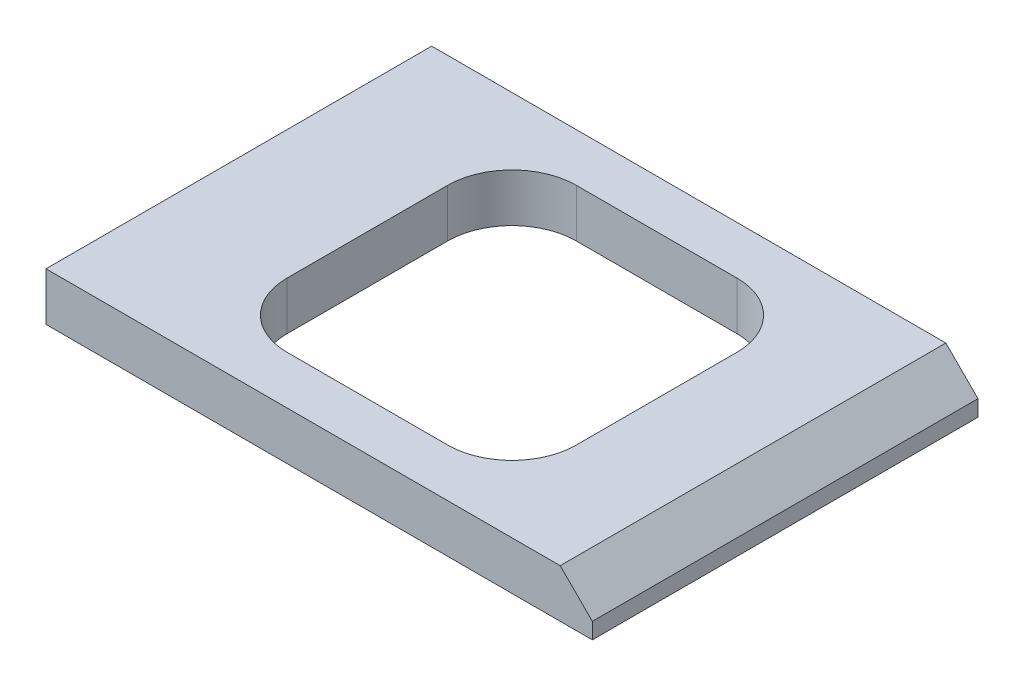
ISO-10303-21;
HEADER;
FILE_DESCRIPTION(('STEP AP214'),'2;1');
FILE_NAME('part.step','',(''),(''),'','','');
FILE_SCHEMA(('AUTOMOTIVE_DESIGN { 1 0 10303 214 1 1 1 1 }'));
ENDSEC;
DATA;
#1=APPLICATION_CONTEXT('core data for automotive mechanical design processes');
#2=APPLICATION_PROTOCOL_DEFINITION('international standard','automotive_design',2000,#1);
#3=PRODUCT_CONTEXT('',#1,'mechanical');
#4=PRODUCT('Part','Part','',(#3));
#5=PRODUCT_RELATED_PRODUCT_CATEGORY('part','',(#4));
#6=PRODUCT_DEFINITION_FORMATION('','',#4);
#7=PRODUCT_DEFINITION_CONTEXT('part definition',#1,'design');
#8=PRODUCT_DEFINITION('design','',#6,#7);
#9=PRODUCT_DEFINITION_SHAPE('','',#8);
#10=(LENGTH_UNIT() NAMED_UNIT(*) SI_UNIT(.MILLI.,.METRE.));
#11=(NAMED_UNIT(*) PLANE_ANGLE_UNIT() SI_UNIT($,.RADIAN.));
#12=(NAMED_UNIT(*) SI_UNIT($,.STERADIAN.) SOLID_ANGLE_UNIT());
#13=UNCERTAINTY_MEASURE_WITH_UNIT(LENGTH_MEASURE(1.E-05),#10,'distance_accuracy_value','');
#14=(GEOMETRIC_REPRESENTATION_CONTEXT(3) GLOBAL_UNCERTAINTY_ASSIGNED_CONTEXT((#13)) GLOBAL_UNIT_ASSIGNED_CONTEXT((#10,
#11,#12)) REPRESENTATION_CONTEXT('',''));
#15=CARTESIAN_POINT('',(0.,0.,0.));
#16=DIRECTION('',(0.,0.,1.));
#17=DIRECTION('',(1.,0.,0.));
#18=AXIS2_PLACEMENT_3D('',#15,#16,#17);
#19=CARTESIAN_POINT('',(-26.9875,2.38125,19.05));
#20=DIRECTION('',(1.,0.,0.));
#21=DIRECTION('',(0.,0.,-1.));
#22=AXIS2_PLACEMENT_3D('',#19,#20,#21);
#23=PLANE('',#22);
#24=DIRECTION('',(0.,0.,1.));
#25=VECTOR('',#24,1.);
#26=CARTESIAN_POINT('',(-26.9875,-2.38125,19.05));
#27=LINE('',#26,#25);
#28=CARTESIAN_POINT('',(-26.9875,-2.38125,-19.05));
#29=VERTEX_POINT('',#28);
#30=CARTESIAN_POINT('',(-26.9875,-2.38125,19.05));
#31=VERTEX_POINT('',#30);
#32=EDGE_CURVE('E155',#29,#31,#27,.T.);
#33=ORIENTED_EDGE('',*,*,#32,.T.);
#34=DIRECTION('',(0.,-1.,0.));
#35=VECTOR('',#34,1.);
#36=CARTESIAN_POINT('',(-26.9875,2.38125,19.05));
#37=LINE('',#36,#35);
#38=CARTESIAN_POINT('',(-26.9875,2.38125,19.05));
#39=VERTEX_POINT('',#38);
#40=EDGE_CURVE('E136',#39,#31,#37,.T.);
#41=ORIENTED_EDGE('',*,*,#40,.F.);
#42=DIRECTION('',(0.,0.,1.));
#43=VECTOR('',#42,1.);
#44=CARTESIAN_POINT('',(-26.9875,2.38125,19.05));
#45=LINE('',#44,#43);
#46=CARTESIAN_POINT('',(-26.9875,2.38125,-19.05));
#47=VERTEX_POINT('',#46);
#48=EDGE_CURVE('E144',#47,#39,#45,.T.);
#49=ORIENTED_EDGE('',*,*,#48,.F.);
#50=DIRECTION('',(0.,-1.,0.));
#51=VECTOR('',#50,1.);
#52=CARTESIAN_POINT('',(-26.9875,2.38125,-19.05));
#53=LINE('',#52,#51);
#54=EDGE_CURVE('E236',#47,#29,#53,.T.);
#55=ORIENTED_EDGE('',*,*,#54,.T.);
#56=EDGE_LOOP('',(#33,#41,#49,#55));
#57=FACE_BOUND('',#56,.T.);
#58=ADVANCED_FACE('F34',(#57),#23,.F.);
#59=CARTESIAN_POINT('',(26.9875,2.38125,19.05));
#60=DIRECTION('',(0.,0.,-1.));
#61=DIRECTION('',(-1.,0.,0.));
#62=AXIS2_PLACEMENT_3D('',#59,#60,#61);
#63=PLANE('',#62);
#64=DIRECTION('',(0.,-1.,0.));
#65=VECTOR('',#64,1.);
#66=CARTESIAN_POINT('',(26.9875,2.38125,19.05));
#67=LINE('',#66,#65);
#68=CARTESIAN_POINT('',(26.9875,-0.793750000000018,19.05));
#69=VERTEX_POINT('',#68);
#70=CARTESIAN_POINT('',(26.9875,-2.38125,19.05));
#71=VERTEX_POINT('',#70);
#72=EDGE_CURVE('E157',#69,#71,#67,.T.);
#73=ORIENTED_EDGE('',*,*,#72,.F.);
#74=DIRECTION('',(-0.707106781186546,0.707106781186549,0.));
#75=VECTOR('',#74,1.);
#76=CARTESIAN_POINT('',(23.8125,2.38125,19.05));
#77=LINE('',#76,#75);
#78=CARTESIAN_POINT('',(23.8125,2.38125,19.05));
#79=VERTEX_POINT('',#78);
#80=EDGE_CURVE('E139',#69,#79,#77,.T.);
#81=ORIENTED_EDGE('',*,*,#80,.T.);
#82=DIRECTION('',(1.,0.,0.));
#83=VECTOR('',#82,1.);
#84=CARTESIAN_POINT('',(26.9875,2.38125,19.05));
#85=LINE('',#84,#83);
#86=EDGE_CURVE('E130',#39,#79,#85,.T.);
#87=ORIENTED_EDGE('',*,*,#86,.F.);
#88=ORIENTED_EDGE('',*,*,#40,.T.);
#89=DIRECTION('',(1.,0.,0.));
#90=VECTOR('',#89,1.);
#91=CARTESIAN_POINT('',(26.9875,-2.38125,19.05));
#92=LINE('',#91,#90);
#93=EDGE_CURVE('E238',#31,#71,#92,.T.);
#94=ORIENTED_EDGE('',*,*,#93,.T.);
#95=EDGE_LOOP('',(#73,#81,#87,#88,#94));
#96=FACE_BOUND('',#95,.T.);
#97=ADVANCED_FACE('F133',(#96),#63,.F.);
#98=CARTESIAN_POINT('',(26.9875,2.38125,19.05));
#99=DIRECTION('',(-1.,0.,0.));
#100=DIRECTION('',(0.,0.,1.));
#101=AXIS2_PLACEMENT_3D('',#98,#99,#100);
#102=PLANE('',#101);
#103=DIRECTION('',(0.,-1.,0.));
#104=VECTOR('',#103,1.);
#105=CARTESIAN_POINT('',(26.9875,2.38125,-19.05));
#106=LINE('',#105,#104);
#107=CARTESIAN_POINT('',(26.9875,-0.793750000000018,-19.05));
#108=VERTEX_POINT('',#107);
#109=CARTESIAN_POINT('',(26.9875,-2.38125,-19.05));
#110=VERTEX_POINT('',#109);
#111=EDGE_CURVE('E161',#108,#110,#106,.T.);
#112=ORIENTED_EDGE('',*,*,#111,.F.);
#113=DIRECTION('',(0.,0.,1.));
#114=VECTOR('',#113,1.);
#115=CARTESIAN_POINT('',(26.9875,-0.793750000000019,19.05));
#116=LINE('',#115,#114);
#117=EDGE_CURVE('E166',#108,#69,#116,.T.);
#118=ORIENTED_EDGE('',*,*,#117,.T.);
#119=ORIENTED_EDGE('',*,*,#72,.T.);
#120=DIRECTION('',(0.,0.,-1.));
#121=VECTOR('',#120,1.);
#122=CARTESIAN_POINT('',(26.9875,-2.38125,19.05));
#123=LINE('',#122,#121);
#124=EDGE_CURVE('E240',#71,#110,#123,.T.);
#125=ORIENTED_EDGE('',*,*,#124,.T.);
#126=EDGE_LOOP('',(#112,#118,#119,#125));
#127=FACE_BOUND('',#126,.T.);
#128=ADVANCED_FACE('F251',(#127),#102,.F.);
#129=CARTESIAN_POINT('',(26.9875,2.38125,-19.05));
#130=DIRECTION('',(0.,0.,1.));
#131=DIRECTION('',(1.,0.,0.));
#132=AXIS2_PLACEMENT_3D('',#129,#130,#131);
#133=PLANE('',#132);
#134=DIRECTION('',(-1.,0.,0.));
#135=VECTOR('',#134,1.);
#136=CARTESIAN_POINT('',(26.9875,2.38125,-19.05));
#137=LINE('',#136,#135);
#138=CARTESIAN_POINT('',(23.8125,2.38125,-19.05));
#139=VERTEX_POINT('',#138);
#140=EDGE_CURVE('E143',#139,#47,#137,.T.);
#141=ORIENTED_EDGE('',*,*,#140,.F.);
#142=DIRECTION('',(0.707106781186546,-0.707106781186549,0.));
#143=VECTOR('',#142,1.);
#144=CARTESIAN_POINT('',(23.8125,2.38125,-19.05));
#145=LINE('',#144,#143);
#146=EDGE_CURVE('E159',#139,#108,#145,.T.);
#147=ORIENTED_EDGE('',*,*,#146,.T.);
#148=ORIENTED_EDGE('',*,*,#111,.T.);
#149=DIRECTION('',(-1.,0.,0.));
#150=VECTOR('',#149,1.);
#151=CARTESIAN_POINT('',(26.9875,-2.38125,-19.05));
#152=LINE('',#151,#150);
#153=EDGE_CURVE('E152',#110,#29,#152,.T.);
#154=ORIENTED_EDGE('',*,*,#153,.T.);
#155=ORIENTED_EDGE('',*,*,#54,.F.);
#156=EDGE_LOOP('',(#141,#147,#148,#154,#155));
#157=FACE_BOUND('',#156,.T.);
#158=ADVANCED_FACE('F246',(#157),#133,.F.);
#159=CARTESIAN_POINT('',(0.,2.38125,0.));
#160=DIRECTION('',(0.,1.,0.));
#161=DIRECTION('',(0.,0.,1.));
#162=AXIS2_PLACEMENT_3D('',#159,#160,#161);
#163=PLANE('',#162);
#164=DIRECTION('',(0.,0.,1.));
#165=VECTOR('',#164,1.);
#166=CARTESIAN_POINT('',(-14.2875,2.38125,0.));
#167=LINE('',#166,#165);
#168=CARTESIAN_POINT('',(-14.2875,2.38125,-7.9375));
#169=VERTEX_POINT('',#168);
#170=CARTESIAN_POINT('',(-14.2875,2.38125,7.9375));
#171=VERTEX_POINT('',#170);
#172=EDGE_CURVE('E201',#169,#171,#167,.T.);
#173=ORIENTED_EDGE('',*,*,#172,.F.);
#174=CARTESIAN_POINT('',(-7.93750000000001,2.38125,-7.9375));
#175=DIRECTION('',(0.,1.,0.));
#176=DIRECTION('',(0.,0.,1.));
#177=AXIS2_PLACEMENT_3D('',#174,#175,#176);
#178=CIRCLE('',#177,6.35);
#179=CARTESIAN_POINT('',(-7.93750000000001,2.38125,-14.2875));
#180=VERTEX_POINT('',#179);
#181=EDGE_CURVE('E196',#169,#180,#178,.F.);
#182=ORIENTED_EDGE('',*,*,#181,.T.);
#183=DIRECTION('',(-1.,0.,0.));
#184=VECTOR('',#183,1.);
#185=CARTESIAN_POINT('',(0.,2.38125,-14.2875));
#186=LINE('',#185,#184);
#187=CARTESIAN_POINT('',(7.93749999999999,2.38125,-14.2875));
#188=VERTEX_POINT('',#187);
#189=EDGE_CURVE('E208',#188,#180,#186,.T.);
#190=ORIENTED_EDGE('',*,*,#189,.F.);
#191=CARTESIAN_POINT('',(7.93749999999999,2.38125,-7.9375));
#192=DIRECTION('',(0.,1.,0.));
#193=DIRECTION('',(0.,0.,1.));
#194=AXIS2_PLACEMENT_3D('',#191,#192,#193);
#195=CIRCLE('',#194,6.35);
#196=CARTESIAN_POINT('',(14.2875,2.38125,-7.9375));
#197=VERTEX_POINT('',#196);
#198=EDGE_CURVE('E188',#188,#197,#195,.F.);
#199=ORIENTED_EDGE('',*,*,#198,.T.);
#200=DIRECTION('',(0.,0.,-1.));
#201=VECTOR('',#200,1.);
#202=CARTESIAN_POINT('',(14.2875,2.38125,0.));
#203=LINE('',#202,#201);
#204=CARTESIAN_POINT('',(14.2875,2.38125,7.93749999999999));
#205=VERTEX_POINT('',#204);
#206=EDGE_CURVE('E230',#205,#197,#203,.T.);
#207=ORIENTED_EDGE('',*,*,#206,.F.);
#208=CARTESIAN_POINT('',(7.9375,2.38125,7.9375));
#209=DIRECTION('',(0.,1.,0.));
#210=DIRECTION('',(0.,0.,1.));
#211=AXIS2_PLACEMENT_3D('',#208,#209,#210);
#212=CIRCLE('',#211,6.35);
#213=CARTESIAN_POINT('',(7.9375,2.38125,14.2875));
#214=VERTEX_POINT('',#213);
#215=EDGE_CURVE('E192',#205,#214,#212,.F.);
#216=ORIENTED_EDGE('',*,*,#215,.T.);
#217=DIRECTION('',(1.,0.,0.));
#218=VECTOR('',#217,1.);
#219=CARTESIAN_POINT('',(0.,2.38125,14.2875));
#220=LINE('',#219,#218);
#221=CARTESIAN_POINT('',(-7.9375,2.38125,14.2875));
#222=VERTEX_POINT('',#221);
#223=EDGE_CURVE('E203',#222,#214,#220,.T.);
#224=ORIENTED_EDGE('',*,*,#223,.F.);
#225=CARTESIAN_POINT('',(-7.9375,2.38125,7.9375));
#226=DIRECTION('',(0.,1.,0.));
#227=DIRECTION('',(0.,0.,1.));
#228=AXIS2_PLACEMENT_3D('',#225,#226,#227);
#229=CIRCLE('',#228,6.35);
#230=EDGE_CURVE('E42',#222,#171,#229,.F.);
#231=ORIENTED_EDGE('',*,*,#230,.T.);
#232=EDGE_LOOP('',(#173,#182,#190,#199,#207,#216,#224,#231));
#233=FACE_BOUND('',#232,.T.);
#234=ORIENTED_EDGE('',*,*,#86,.T.);
#235=DIRECTION('',(0.,0.,-1.));
#236=VECTOR('',#235,1.);
#237=CARTESIAN_POINT('',(23.8125,2.38125,-19.05));
#238=LINE('',#237,#236);
#239=EDGE_CURVE('E156',#79,#139,#238,.T.);
#240=ORIENTED_EDGE('',*,*,#239,.T.);
#241=ORIENTED_EDGE('',*,*,#140,.T.);
#242=ORIENTED_EDGE('',*,*,#48,.T.);
#243=EDGE_LOOP('',(#234,#240,#241,#242));
#244=FACE_BOUND('',#243,.T.);
#245=ADVANCED_FACE('F147',(#233,#244),#163,.T.);
#246=CARTESIAN_POINT('',(0.,-2.38125,0.));
#247=DIRECTION('',(0.,1.,0.));
#248=DIRECTION('',(0.,0.,1.));
#249=AXIS2_PLACEMENT_3D('',#246,#247,#248);
#250=PLANE('',#249);
#251=DIRECTION('',(0.,0.,-1.));
#252=VECTOR('',#251,1.);
#253=CARTESIAN_POINT('',(14.2875,-2.38125,-14.2875));
#254=LINE('',#253,#252);
#255=CARTESIAN_POINT('',(14.2875,-2.38125,7.93749999999999));
#256=VERTEX_POINT('',#255);
#257=CARTESIAN_POINT('',(14.2875,-2.38125,-7.9375));
#258=VERTEX_POINT('',#257);
#259=EDGE_CURVE('E222',#256,#258,#254,.T.);
#260=ORIENTED_EDGE('',*,*,#259,.T.);
#261=CARTESIAN_POINT('',(7.93749999999999,-2.38125,-7.9375));
#262=DIRECTION('',(0.,1.,0.));
#263=DIRECTION('',(0.,0.,1.));
#264=AXIS2_PLACEMENT_3D('',#261,#262,#263);
#265=CIRCLE('',#264,6.35);
#266=CARTESIAN_POINT('',(7.93749999999999,-2.38125,-14.2875));
#267=VERTEX_POINT('',#266);
#268=EDGE_CURVE('E190',#258,#267,#265,.T.);
#269=ORIENTED_EDGE('',*,*,#268,.T.);
#270=DIRECTION('',(-1.,0.,0.));
#271=VECTOR('',#270,1.);
#272=CARTESIAN_POINT('',(14.2875,-2.38125,-14.2875));
#273=LINE('',#272,#271);
#274=CARTESIAN_POINT('',(-7.93750000000001,-2.38125,-14.2875));
#275=VERTEX_POINT('',#274);
#276=EDGE_CURVE('E224',#267,#275,#273,.T.);
#277=ORIENTED_EDGE('',*,*,#276,.T.);
#278=CARTESIAN_POINT('',(-7.93750000000001,-2.38125,-7.9375));
#279=DIRECTION('',(0.,1.,0.));
#280=DIRECTION('',(0.,0.,1.));
#281=AXIS2_PLACEMENT_3D('',#278,#279,#280);
#282=CIRCLE('',#281,6.35);
#283=CARTESIAN_POINT('',(-14.2875,-2.38125,-7.9375));
#284=VERTEX_POINT('',#283);
#285=EDGE_CURVE('E56',#275,#284,#282,.T.);
#286=ORIENTED_EDGE('',*,*,#285,.T.);
#287=DIRECTION('',(0.,0.,1.));
#288=VECTOR('',#287,1.);
#289=CARTESIAN_POINT('',(-14.2875,-2.38125,-14.2875));
#290=LINE('',#289,#288);
#291=CARTESIAN_POINT('',(-14.2875,-2.38125,7.9375));
#292=VERTEX_POINT('',#291);
#293=EDGE_CURVE('E218',#284,#292,#290,.T.);
#294=ORIENTED_EDGE('',*,*,#293,.T.);
#295=CARTESIAN_POINT('',(-7.9375,-2.38125,7.9375));
#296=DIRECTION('',(0.,1.,0.));
#297=DIRECTION('',(0.,0.,1.));
#298=AXIS2_PLACEMENT_3D('',#295,#296,#297);
#299=CIRCLE('',#298,6.35);
#300=CARTESIAN_POINT('',(-7.9375,-2.38125,14.2875));
#301=VERTEX_POINT('',#300);
#302=EDGE_CURVE('E11',#292,#301,#299,.T.);
#303=ORIENTED_EDGE('',*,*,#302,.T.);
#304=DIRECTION('',(1.,0.,0.));
#305=VECTOR('',#304,1.);
#306=CARTESIAN_POINT('',(14.2875,-2.38125,14.2875));
#307=LINE('',#306,#305);
#308=CARTESIAN_POINT('',(7.9375,-2.38125,14.2875));
#309=VERTEX_POINT('',#308);
#310=EDGE_CURVE('E216',#301,#309,#307,.T.);
#311=ORIENTED_EDGE('',*,*,#310,.T.);
#312=CARTESIAN_POINT('',(7.9375,-2.38125,7.9375));
#313=DIRECTION('',(0.,1.,0.));
#314=DIRECTION('',(0.,0.,1.));
#315=AXIS2_PLACEMENT_3D('',#312,#313,#314);
#316=CIRCLE('',#315,6.35);
#317=EDGE_CURVE('E194',#309,#256,#316,.T.);
#318=ORIENTED_EDGE('',*,*,#317,.T.);
#319=EDGE_LOOP('',(#260,#269,#277,#286,#294,#303,#311,#318));
#320=FACE_BOUND('',#319,.T.);
#321=ORIENTED_EDGE('',*,*,#32,.F.);
#322=ORIENTED_EDGE('',*,*,#153,.F.);
#323=ORIENTED_EDGE('',*,*,#124,.F.);
#324=ORIENTED_EDGE('',*,*,#93,.F.);
#325=EDGE_LOOP('',(#321,#322,#323,#324));
#326=FACE_BOUND('',#325,.T.);
#327=ADVANCED_FACE('F214',(#320,#326),#250,.F.);
#328=CARTESIAN_POINT('',(23.8125,2.38125,0.));
#329=DIRECTION('',(0.707106781186549,0.707106781186546,0.));
#330=DIRECTION('',(0.,0.,1.));
#331=AXIS2_PLACEMENT_3D('',#328,#329,#330);
#332=PLANE('',#331);
#333=ORIENTED_EDGE('',*,*,#80,.F.);
#334=ORIENTED_EDGE('',*,*,#117,.F.);
#335=ORIENTED_EDGE('',*,*,#146,.F.);
#336=ORIENTED_EDGE('',*,*,#239,.F.);
#337=EDGE_LOOP('',(#333,#334,#335,#336));
#338=FACE_BOUND('',#337,.T.);
#339=ADVANCED_FACE('F253',(#338),#332,.T.);
#340=CARTESIAN_POINT('',(-14.2875,-2.38125,-14.2875));
#341=DIRECTION('',(-1.,0.,0.));
#342=DIRECTION('',(0.,0.,1.));
#343=AXIS2_PLACEMENT_3D('',#340,#341,#342);
#344=PLANE('',#343);
#345=ORIENTED_EDGE('',*,*,#293,.F.);
#346=DIRECTION('',(0.,1.,0.));
#347=VECTOR('',#346,1.);
#348=CARTESIAN_POINT('',(-14.2875,2.38125,-7.9375));
#349=LINE('',#348,#347);
#350=EDGE_CURVE('E185',#284,#169,#349,.T.);
#351=ORIENTED_EDGE('',*,*,#350,.T.);
#352=ORIENTED_EDGE('',*,*,#172,.T.);
#353=DIRECTION('',(0.,1.,0.));
#354=VECTOR('',#353,1.);
#355=CARTESIAN_POINT('',(-14.2875,-2.38125,7.9375));
#356=LINE('',#355,#354);
#357=EDGE_CURVE('E49',#171,#292,#356,.F.);
#358=ORIENTED_EDGE('',*,*,#357,.T.);
#359=EDGE_LOOP('',(#345,#351,#352,#358));
#360=FACE_BOUND('',#359,.T.);
#361=ADVANCED_FACE('F206',(#360),#344,.F.);
#362=CARTESIAN_POINT('',(14.2875,-2.38125,-14.2875));
#363=DIRECTION('',(0.,0.,-1.));
#364=DIRECTION('',(-1.,0.,0.));
#365=AXIS2_PLACEMENT_3D('',#362,#363,#364);
#366=PLANE('',#365);
#367=ORIENTED_EDGE('',*,*,#276,.F.);
#368=DIRECTION('',(0.,1.,0.));
#369=VECTOR('',#368,1.);
#370=CARTESIAN_POINT('',(7.93749999999999,2.38125,-14.2875));
#371=LINE('',#370,#369);
#372=EDGE_CURVE('E171',#267,#188,#371,.T.);
#373=ORIENTED_EDGE('',*,*,#372,.T.);
#374=ORIENTED_EDGE('',*,*,#189,.T.);
#375=DIRECTION('',(0.,1.,0.));
#376=VECTOR('',#375,1.);
#377=CARTESIAN_POINT('',(-7.93750000000001,-2.38125,-14.2875));
#378=LINE('',#377,#376);
#379=EDGE_CURVE('E169',#180,#275,#378,.F.);
#380=ORIENTED_EDGE('',*,*,#379,.T.);
#381=EDGE_LOOP('',(#367,#373,#374,#380));
#382=FACE_BOUND('',#381,.T.);
#383=ADVANCED_FACE('F260',(#382),#366,.F.);
#384=CARTESIAN_POINT('',(14.2875,-2.38125,-14.2875));
#385=DIRECTION('',(1.,0.,0.));
#386=DIRECTION('',(0.,0.,-1.));
#387=AXIS2_PLACEMENT_3D('',#384,#385,#386);
#388=PLANE('',#387);
#389=ORIENTED_EDGE('',*,*,#206,.T.);
#390=DIRECTION('',(0.,1.,0.));
#391=VECTOR('',#390,1.);
#392=CARTESIAN_POINT('',(14.2875,-2.38125,-7.9375));
#393=LINE('',#392,#391);
#394=EDGE_CURVE('E177',#197,#258,#393,.F.);
#395=ORIENTED_EDGE('',*,*,#394,.T.);
#396=ORIENTED_EDGE('',*,*,#259,.F.);
#397=DIRECTION('',(0.,1.,0.));
#398=VECTOR('',#397,1.);
#399=CARTESIAN_POINT('',(14.2875,2.38125,7.93749999999999));
#400=LINE('',#399,#398);
#401=EDGE_CURVE('E174',#256,#205,#400,.T.);
#402=ORIENTED_EDGE('',*,*,#401,.T.);
#403=EDGE_LOOP('',(#389,#395,#396,#402));
#404=FACE_BOUND('',#403,.T.);
#405=ADVANCED_FACE('F280',(#404),#388,.F.);
#406=CARTESIAN_POINT('',(14.2875,-2.38125,14.2875));
#407=DIRECTION('',(0.,0.,1.));
#408=DIRECTION('',(1.,0.,0.));
#409=AXIS2_PLACEMENT_3D('',#406,#407,#408);
#410=PLANE('',#409);
#411=ORIENTED_EDGE('',*,*,#223,.T.);
#412=DIRECTION('',(0.,1.,0.));
#413=VECTOR('',#412,1.);
#414=CARTESIAN_POINT('',(7.9375,-2.38125,14.2875));
#415=LINE('',#414,#413);
#416=EDGE_CURVE('E182',#214,#309,#415,.F.);
#417=ORIENTED_EDGE('',*,*,#416,.T.);
#418=ORIENTED_EDGE('',*,*,#310,.F.);
#419=DIRECTION('',(0.,1.,0.));
#420=VECTOR('',#419,1.);
#421=CARTESIAN_POINT('',(-7.9375,2.38125,14.2875));
#422=LINE('',#421,#420);
#423=EDGE_CURVE('E179',#301,#222,#422,.T.);
#424=ORIENTED_EDGE('',*,*,#423,.T.);
#425=EDGE_LOOP('',(#411,#417,#418,#424));
#426=FACE_BOUND('',#425,.T.);
#427=ADVANCED_FACE('F220',(#426),#410,.F.);
#428=CARTESIAN_POINT('',(7.93749999999999,-2.38125,-7.9375));
#429=DIRECTION('',(0.,-1.,0.));
#430=DIRECTION('',(0.,0.,-1.));
#431=AXIS2_PLACEMENT_3D('',#428,#429,#430);
#432=CYLINDRICAL_SURFACE('',#431,6.35);
#433=ORIENTED_EDGE('',*,*,#268,.F.);
#434=ORIENTED_EDGE('',*,*,#394,.F.);
#435=ORIENTED_EDGE('',*,*,#198,.F.);
#436=ORIENTED_EDGE('',*,*,#372,.F.);
#437=EDGE_LOOP('',(#433,#434,#435,#436));
#438=FACE_BOUND('',#437,.T.);
#439=ADVANCED_FACE('F279',(#438),#432,.F.);
#440=CARTESIAN_POINT('',(7.9375,-2.38125,7.9375));
#441=DIRECTION('',(0.,-1.,0.));
#442=DIRECTION('',(0.,0.,-1.));
#443=AXIS2_PLACEMENT_3D('',#440,#441,#442);
#444=CYLINDRICAL_SURFACE('',#443,6.35);
#445=ORIENTED_EDGE('',*,*,#317,.F.);
#446=ORIENTED_EDGE('',*,*,#416,.F.);
#447=ORIENTED_EDGE('',*,*,#215,.F.);
#448=ORIENTED_EDGE('',*,*,#401,.F.);
#449=EDGE_LOOP('',(#445,#446,#447,#448));
#450=FACE_BOUND('',#449,.T.);
#451=ADVANCED_FACE('F299',(#450),#444,.F.);
#452=CARTESIAN_POINT('',(-7.93750000000001,-2.38125,-7.9375));
#453=DIRECTION('',(0.,-1.,0.));
#454=DIRECTION('',(0.,0.,-1.));
#455=AXIS2_PLACEMENT_3D('',#452,#453,#454);
#456=CYLINDRICAL_SURFACE('',#455,6.35);
#457=ORIENTED_EDGE('',*,*,#285,.F.);
#458=ORIENTED_EDGE('',*,*,#379,.F.);
#459=ORIENTED_EDGE('',*,*,#181,.F.);
#460=ORIENTED_EDGE('',*,*,#350,.F.);
#461=EDGE_LOOP('',(#457,#458,#459,#460));
#462=FACE_BOUND('',#461,.T.);
#463=ADVANCED_FACE('F301',(#462),#456,.F.);
#464=CARTESIAN_POINT('',(-7.9375,-2.38125,7.9375));
#465=DIRECTION('',(0.,-1.,0.));
#466=DIRECTION('',(0.,0.,-1.));
#467=AXIS2_PLACEMENT_3D('',#464,#465,#466);
#468=CYLINDRICAL_SURFACE('',#467,6.35);
#469=ORIENTED_EDGE('',*,*,#302,.F.);
#470=ORIENTED_EDGE('',*,*,#357,.F.);
#471=ORIENTED_EDGE('',*,*,#230,.F.);
#472=ORIENTED_EDGE('',*,*,#423,.F.);
#473=EDGE_LOOP('',(#469,#470,#471,#472));
#474=FACE_BOUND('',#473,.T.);
#475=ADVANCED_FACE('F36',(#474),#468,.F.);
#476=CLOSED_SHELL('',(#58,#97,#128,#158,#245,#327,#339,#361,#383,#405,#427,#439,#451,#463,#475));
#477=MANIFOLD_SOLID_BREP('B2',#476);
#478=ADVANCED_BREP_SHAPE_REPRESENTATION('',(#18,#477),#14);
#479=SHAPE_DEFINITION_REPRESENTATION(#9,#478);
ENDSEC;
END-ISO-10303-21;
